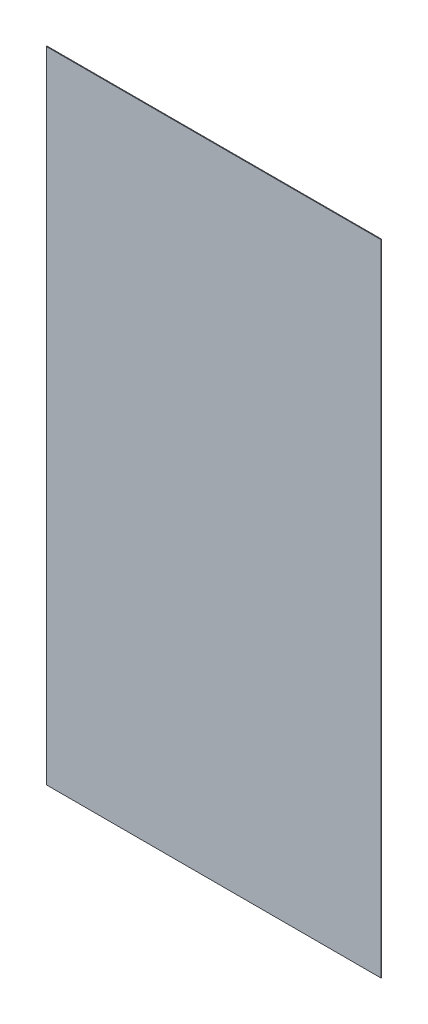
ISO-10303-21;
HEADER;
FILE_DESCRIPTION(('STEP AP214'),'2;1');
FILE_NAME('part.step','',(''),(''),'','','');
FILE_SCHEMA(('AUTOMOTIVE_DESIGN { 1 0 10303 214 1 1 1 1 }'));
ENDSEC;
DATA;
#1=APPLICATION_CONTEXT('core data for automotive mechanical design processes');
#2=APPLICATION_PROTOCOL_DEFINITION('international standard','automotive_design',2000,#1);
#3=PRODUCT_CONTEXT('',#1,'mechanical');
#4=PRODUCT('Part','Part','',(#3));
#5=PRODUCT_RELATED_PRODUCT_CATEGORY('part','',(#4));
#6=PRODUCT_DEFINITION_FORMATION('','',#4);
#7=PRODUCT_DEFINITION_CONTEXT('part definition',#1,'design');
#8=PRODUCT_DEFINITION('design','',#6,#7);
#9=PRODUCT_DEFINITION_SHAPE('','',#8);
#10=(LENGTH_UNIT() NAMED_UNIT(*) SI_UNIT(.MILLI.,.METRE.));
#11=(NAMED_UNIT(*) PLANE_ANGLE_UNIT() SI_UNIT($,.RADIAN.));
#12=(NAMED_UNIT(*) SI_UNIT($,.STERADIAN.) SOLID_ANGLE_UNIT());
#13=UNCERTAINTY_MEASURE_WITH_UNIT(LENGTH_MEASURE(1.E-05),#10,'distance_accuracy_value','');
#14=(GEOMETRIC_REPRESENTATION_CONTEXT(3) GLOBAL_UNCERTAINTY_ASSIGNED_CONTEXT((#13)) GLOBAL_UNIT_ASSIGNED_CONTEXT((#10,
#11,#12)) REPRESENTATION_CONTEXT('',''));
#15=CARTESIAN_POINT('',(0.,0.,0.));
#16=DIRECTION('',(0.,0.,1.));
#17=DIRECTION('',(1.,0.,0.));
#18=AXIS2_PLACEMENT_3D('',#15,#16,#17);
#19=CARTESIAN_POINT('',(0.,0.,1.));
#20=DIRECTION('',(1.,0.,0.));
#21=DIRECTION('',(0.,0.,-1.));
#22=AXIS2_PLACEMENT_3D('',#19,#20,#21);
#23=PLANE('',#22);
#24=DIRECTION('',(0.,-1.,0.));
#25=VECTOR('',#24,1.);
#26=CARTESIAN_POINT('',(0.,0.,0.));
#27=LINE('',#26,#25);
#28=CARTESIAN_POINT('',(0.,860.,0.));
#29=VERTEX_POINT('',#28);
#30=CARTESIAN_POINT('',(0.,0.,0.));
#31=VERTEX_POINT('',#30);
#32=EDGE_CURVE('E119',#29,#31,#27,.T.);
#33=ORIENTED_EDGE('',*,*,#32,.T.);
#34=DIRECTION('',(0.,0.,-1.));
#35=VECTOR('',#34,1.);
#36=CARTESIAN_POINT('',(0.,0.,1.));
#37=LINE('',#36,#35);
#38=CARTESIAN_POINT('',(0.,0.,1.));
#39=VERTEX_POINT('',#38);
#40=EDGE_CURVE('E11',#39,#31,#37,.T.);
#41=ORIENTED_EDGE('',*,*,#40,.F.);
#42=DIRECTION('',(0.,-1.,0.));
#43=VECTOR('',#42,1.);
#44=CARTESIAN_POINT('',(0.,0.,1.));
#45=LINE('',#44,#43);
#46=CARTESIAN_POINT('',(0.,860.,1.));
#47=VERTEX_POINT('',#46);
#48=EDGE_CURVE('E103',#47,#39,#45,.T.);
#49=ORIENTED_EDGE('',*,*,#48,.F.);
#50=DIRECTION('',(0.,0.,-1.));
#51=VECTOR('',#50,1.);
#52=CARTESIAN_POINT('',(0.,860.,1.));
#53=LINE('',#52,#51);
#54=EDGE_CURVE('E115',#47,#29,#53,.T.);
#55=ORIENTED_EDGE('',*,*,#54,.T.);
#56=EDGE_LOOP('',(#33,#41,#49,#55));
#57=FACE_BOUND('',#56,.T.);
#58=ADVANCED_FACE('F51',(#57),#23,.F.);
#59=CARTESIAN_POINT('',(0.,0.,1.));
#60=DIRECTION('',(0.,1.,0.));
#61=DIRECTION('',(0.,0.,1.));
#62=AXIS2_PLACEMENT_3D('',#59,#60,#61);
#63=PLANE('',#62);
#64=DIRECTION('',(1.,0.,0.));
#65=VECTOR('',#64,1.);
#66=CARTESIAN_POINT('',(0.,0.,0.));
#67=LINE('',#66,#65);
#68=CARTESIAN_POINT('',(450.,0.,0.));
#69=VERTEX_POINT('',#68);
#70=EDGE_CURVE('E108',#31,#69,#67,.T.);
#71=ORIENTED_EDGE('',*,*,#70,.T.);
#72=DIRECTION('',(0.,0.,-1.));
#73=VECTOR('',#72,1.);
#74=CARTESIAN_POINT('',(450.,0.,1.));
#75=LINE('',#74,#73);
#76=CARTESIAN_POINT('',(450.,0.,1.));
#77=VERTEX_POINT('',#76);
#78=EDGE_CURVE('E60',#77,#69,#75,.T.);
#79=ORIENTED_EDGE('',*,*,#78,.F.);
#80=DIRECTION('',(1.,0.,0.));
#81=VECTOR('',#80,1.);
#82=CARTESIAN_POINT('',(0.,0.,1.));
#83=LINE('',#82,#81);
#84=EDGE_CURVE('E98',#39,#77,#83,.T.);
#85=ORIENTED_EDGE('',*,*,#84,.F.);
#86=ORIENTED_EDGE('',*,*,#40,.T.);
#87=EDGE_LOOP('',(#71,#79,#85,#86));
#88=FACE_BOUND('',#87,.T.);
#89=ADVANCED_FACE('F107',(#88),#63,.F.);
#90=CARTESIAN_POINT('',(450.,0.,1.));
#91=DIRECTION('',(-1.,0.,0.));
#92=DIRECTION('',(0.,0.,1.));
#93=AXIS2_PLACEMENT_3D('',#90,#91,#92);
#94=PLANE('',#93);
#95=DIRECTION('',(0.,1.,0.));
#96=VECTOR('',#95,1.);
#97=CARTESIAN_POINT('',(450.,0.,0.));
#98=LINE('',#97,#96);
#99=CARTESIAN_POINT('',(450.,860.,0.));
#100=VERTEX_POINT('',#99);
#101=EDGE_CURVE('E85',#69,#100,#98,.T.);
#102=ORIENTED_EDGE('',*,*,#101,.T.);
#103=DIRECTION('',(0.,0.,-1.));
#104=VECTOR('',#103,1.);
#105=CARTESIAN_POINT('',(450.,860.,1.));
#106=LINE('',#105,#104);
#107=CARTESIAN_POINT('',(450.,860.,1.));
#108=VERTEX_POINT('',#107);
#109=EDGE_CURVE('E110',#108,#100,#106,.T.);
#110=ORIENTED_EDGE('',*,*,#109,.F.);
#111=DIRECTION('',(0.,1.,0.));
#112=VECTOR('',#111,1.);
#113=CARTESIAN_POINT('',(450.,0.,1.));
#114=LINE('',#113,#112);
#115=EDGE_CURVE('E101',#77,#108,#114,.T.);
#116=ORIENTED_EDGE('',*,*,#115,.F.);
#117=ORIENTED_EDGE('',*,*,#78,.T.);
#118=EDGE_LOOP('',(#102,#110,#116,#117));
#119=FACE_BOUND('',#118,.T.);
#120=ADVANCED_FACE('F111',(#119),#94,.F.);
#121=CARTESIAN_POINT('',(0.,860.,1.));
#122=DIRECTION('',(0.,-1.,0.));
#123=DIRECTION('',(0.,0.,-1.));
#124=AXIS2_PLACEMENT_3D('',#121,#122,#123);
#125=PLANE('',#124);
#126=DIRECTION('',(-1.,0.,0.));
#127=VECTOR('',#126,1.);
#128=CARTESIAN_POINT('',(0.,860.,0.));
#129=LINE('',#128,#127);
#130=EDGE_CURVE('E91',#100,#29,#129,.T.);
#131=ORIENTED_EDGE('',*,*,#130,.T.);
#132=ORIENTED_EDGE('',*,*,#54,.F.);
#133=DIRECTION('',(-1.,0.,0.));
#134=VECTOR('',#133,1.);
#135=CARTESIAN_POINT('',(0.,860.,1.));
#136=LINE('',#135,#134);
#137=EDGE_CURVE('E68',#108,#47,#136,.T.);
#138=ORIENTED_EDGE('',*,*,#137,.F.);
#139=ORIENTED_EDGE('',*,*,#109,.T.);
#140=EDGE_LOOP('',(#131,#132,#138,#139));
#141=FACE_BOUND('',#140,.T.);
#142=ADVANCED_FACE('F132',(#141),#125,.F.);
#143=CARTESIAN_POINT('',(0.,0.,1.));
#144=DIRECTION('',(0.,0.,-1.));
#145=DIRECTION('',(-1.,0.,0.));
#146=AXIS2_PLACEMENT_3D('',#143,#144,#145);
#147=PLANE('',#146);
#148=ORIENTED_EDGE('',*,*,#48,.T.);
#149=ORIENTED_EDGE('',*,*,#84,.T.);
#150=ORIENTED_EDGE('',*,*,#115,.T.);
#151=ORIENTED_EDGE('',*,*,#137,.T.);
#152=EDGE_LOOP('',(#148,#149,#150,#151));
#153=FACE_BOUND('',#152,.T.);
#154=ADVANCED_FACE('F99',(#153),#147,.F.);
#155=CARTESIAN_POINT('',(0.,0.,0.));
#156=DIRECTION('',(0.,0.,-1.));
#157=DIRECTION('',(-1.,0.,0.));
#158=AXIS2_PLACEMENT_3D('',#155,#156,#157);
#159=PLANE('',#158);
#160=ORIENTED_EDGE('',*,*,#32,.F.);
#161=ORIENTED_EDGE('',*,*,#130,.F.);
#162=ORIENTED_EDGE('',*,*,#101,.F.);
#163=ORIENTED_EDGE('',*,*,#70,.F.);
#164=EDGE_LOOP('',(#160,#161,#162,#163));
#165=FACE_BOUND('',#164,.T.);
#166=ADVANCED_FACE('F135',(#165),#159,.T.);
#167=CLOSED_SHELL('',(#58,#89,#120,#142,#154,#166));
#168=MANIFOLD_SOLID_BREP('B2',#167);
#169=ADVANCED_BREP_SHAPE_REPRESENTATION('',(#18,#168),#14);
#170=SHAPE_DEFINITION_REPRESENTATION(#9,#169);
ENDSEC;
END-ISO-10303-21;
